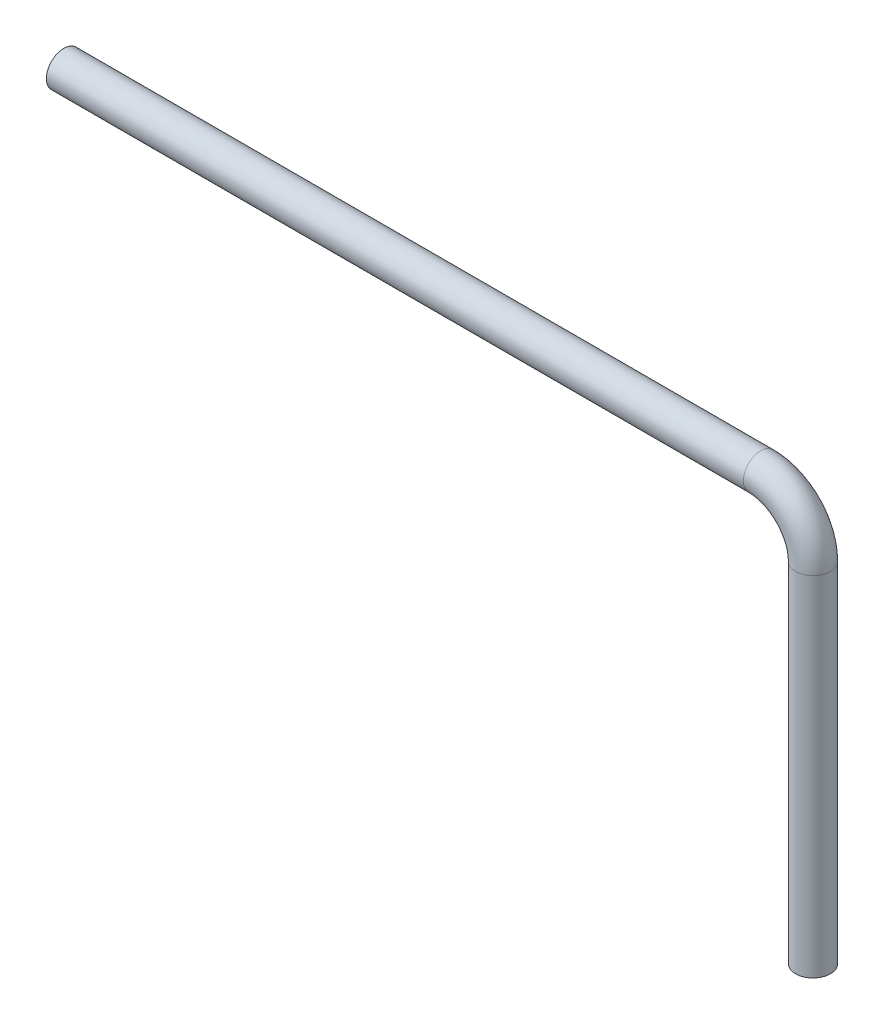
ISO-10303-21;
HEADER;
FILE_DESCRIPTION(('STEP AP214'),'2;1');
FILE_NAME('part.step','',(''),(''),'','','');
FILE_SCHEMA(('AUTOMOTIVE_DESIGN { 1 0 10303 214 1 1 1 1 }'));
ENDSEC;
DATA;
#1=APPLICATION_CONTEXT('core data for automotive mechanical design processes');
#2=APPLICATION_PROTOCOL_DEFINITION('international standard','automotive_design',2000,#1);
#3=PRODUCT_CONTEXT('',#1,'mechanical');
#4=PRODUCT('Part','Part','',(#3));
#5=PRODUCT_RELATED_PRODUCT_CATEGORY('part','',(#4));
#6=PRODUCT_DEFINITION_FORMATION('','',#4);
#7=PRODUCT_DEFINITION_CONTEXT('part definition',#1,'design');
#8=PRODUCT_DEFINITION('design','',#6,#7);
#9=PRODUCT_DEFINITION_SHAPE('','',#8);
#10=(LENGTH_UNIT() NAMED_UNIT(*) SI_UNIT(.MILLI.,.METRE.));
#11=(NAMED_UNIT(*) PLANE_ANGLE_UNIT() SI_UNIT($,.RADIAN.));
#12=(NAMED_UNIT(*) SI_UNIT($,.STERADIAN.) SOLID_ANGLE_UNIT());
#13=UNCERTAINTY_MEASURE_WITH_UNIT(LENGTH_MEASURE(1.E-05),#10,'distance_accuracy_value','');
#14=(GEOMETRIC_REPRESENTATION_CONTEXT(3) GLOBAL_UNCERTAINTY_ASSIGNED_CONTEXT((#13)) GLOBAL_UNIT_ASSIGNED_CONTEXT((#10,
#11,#12)) REPRESENTATION_CONTEXT('',''));
#15=CARTESIAN_POINT('',(0.,0.,0.));
#16=DIRECTION('',(0.,0.,1.));
#17=DIRECTION('',(1.,0.,0.));
#18=AXIS2_PLACEMENT_3D('',#15,#16,#17);
#19=CARTESIAN_POINT('',(0.,0.,0.));
#20=DIRECTION('',(0.,1.,0.));
#21=DIRECTION('',(0.,0.,1.));
#22=AXIS2_PLACEMENT_3D('',#19,#20,#21);
#23=PLANE('',#22);
#24=CARTESIAN_POINT('',(0.,0.,0.));
#25=DIRECTION('',(0.,1.,0.));
#26=DIRECTION('',(0.,0.,1.));
#27=AXIS2_PLACEMENT_3D('',#24,#25,#26);
#28=CIRCLE('',#27,25.);
#29=CARTESIAN_POINT('',(0.,0.,25.));
#30=VERTEX_POINT('',#29);
#31=EDGE_CURVE('E51',#30,#30,#28,.T.);
#32=ORIENTED_EDGE('',*,*,#31,.F.);
#33=EDGE_LOOP('',(#32));
#34=FACE_BOUND('',#33,.T.);
#35=ADVANCED_FACE('F40',(#34),#23,.F.);
#36=CARTESIAN_POINT('',(-1075.,574.999999999995,0.));
#37=DIRECTION('',(-1.,0.,0.));
#38=DIRECTION('',(0.,0.,1.));
#39=AXIS2_PLACEMENT_3D('',#36,#37,#38);
#40=PLANE('',#39);
#41=CARTESIAN_POINT('',(-1075.,574.999999999995,0.));
#42=DIRECTION('',(-1.,0.,0.));
#43=DIRECTION('',(0.,0.,1.));
#44=AXIS2_PLACEMENT_3D('',#41,#42,#43);
#45=CIRCLE('',#44,25.);
#46=CARTESIAN_POINT('',(-1075.,574.999999999995,25.));
#47=VERTEX_POINT('',#46);
#48=EDGE_CURVE('E10',#47,#47,#45,.T.);
#49=ORIENTED_EDGE('',*,*,#48,.T.);
#50=EDGE_LOOP('',(#49));
#51=FACE_BOUND('',#50,.T.);
#52=ADVANCED_FACE('F58',(#51),#40,.T.);
#53=CARTESIAN_POINT('',(0.,0.,0.));
#54=DIRECTION('',(0.,1.,0.));
#55=DIRECTION('',(0.,0.,1.));
#56=AXIS2_PLACEMENT_3D('',#53,#54,#55);
#57=CYLINDRICAL_SURFACE('',#56,25.);
#58=CARTESIAN_POINT('',(0.,500.,0.));
#59=DIRECTION('',(0.,1.,0.));
#60=DIRECTION('',(0.,0.,1.));
#61=AXIS2_PLACEMENT_3D('',#58,#59,#60);
#62=CIRCLE('',#61,25.);
#63=CARTESIAN_POINT('',(25.,500.,0.));
#64=VERTEX_POINT('',#63);
#65=EDGE_CURVE('E50',#64,#64,#62,.T.);
#66=ORIENTED_EDGE('',*,*,#65,.F.);
#67=EDGE_LOOP('',(#66));
#68=FACE_BOUND('',#67,.T.);
#69=ORIENTED_EDGE('',*,*,#31,.T.);
#70=EDGE_LOOP('',(#69));
#71=FACE_BOUND('',#70,.T.);
#72=ADVANCED_FACE('F60',(#68,#71),#57,.T.);
#73=CARTESIAN_POINT('',(-75.,500.,0.));
#74=DIRECTION('',(0.,0.,1.));
#75=DIRECTION('',(1.,0.,0.));
#76=AXIS2_PLACEMENT_3D('',#73,#74,#75);
#77=TOROIDAL_SURFACE('',#76,75.,25.);
#78=CARTESIAN_POINT('',(-75.0000000000004,575.,0.));
#79=DIRECTION('',(-1.,0.,0.));
#80=DIRECTION('',(0.,0.,1.));
#81=AXIS2_PLACEMENT_3D('',#78,#79,#80);
#82=CIRCLE('',#81,25.);
#83=CARTESIAN_POINT('',(-75.0000000000005,600.,0.));
#84=VERTEX_POINT('',#83);
#85=EDGE_CURVE('E43',#84,#84,#82,.T.);
#86=CARTESIAN_POINT('',(-75.,500.,0.));
#87=DIRECTION('',(0.,0.,1.));
#88=DIRECTION('',(1.,0.,0.));
#89=AXIS2_PLACEMENT_3D('',#86,#87,#88);
#90=CIRCLE('',#89,100.);
#91=EDGE_CURVE('',#64,#84,#90,.T.);
#92=ORIENTED_EDGE('',*,*,#65,.T.);
#93=ORIENTED_EDGE('',*,*,#85,.F.);
#94=ORIENTED_EDGE('',*,*,#91,.T.);
#95=ORIENTED_EDGE('',*,*,#91,.F.);
#96=EDGE_LOOP('',(#92,#94,#93,#95));
#97=FACE_BOUND('',#96,.T.);
#98=ADVANCED_FACE('F67',(#97),#77,.T.);
#99=CARTESIAN_POINT('',(-75.0000000000004,575.,0.));
#100=DIRECTION('',(-1.,0.,0.));
#101=DIRECTION('',(0.,-1.,0.));
#102=AXIS2_PLACEMENT_3D('',#99,#100,#101);
#103=CYLINDRICAL_SURFACE('',#102,25.);
#104=ORIENTED_EDGE('',*,*,#48,.F.);
#105=EDGE_LOOP('',(#104));
#106=FACE_BOUND('',#105,.T.);
#107=ORIENTED_EDGE('',*,*,#85,.T.);
#108=EDGE_LOOP('',(#107));
#109=FACE_BOUND('',#108,.T.);
#110=ADVANCED_FACE('F62',(#106,#109),#103,.T.);
#111=CLOSED_SHELL('',(#35,#52,#72,#98,#110));
#112=MANIFOLD_SOLID_BREP('B2',#111);
#113=ADVANCED_BREP_SHAPE_REPRESENTATION('',(#18,#112),#14);
#114=SHAPE_DEFINITION_REPRESENTATION(#9,#113);
ENDSEC;
END-ISO-10303-21;
